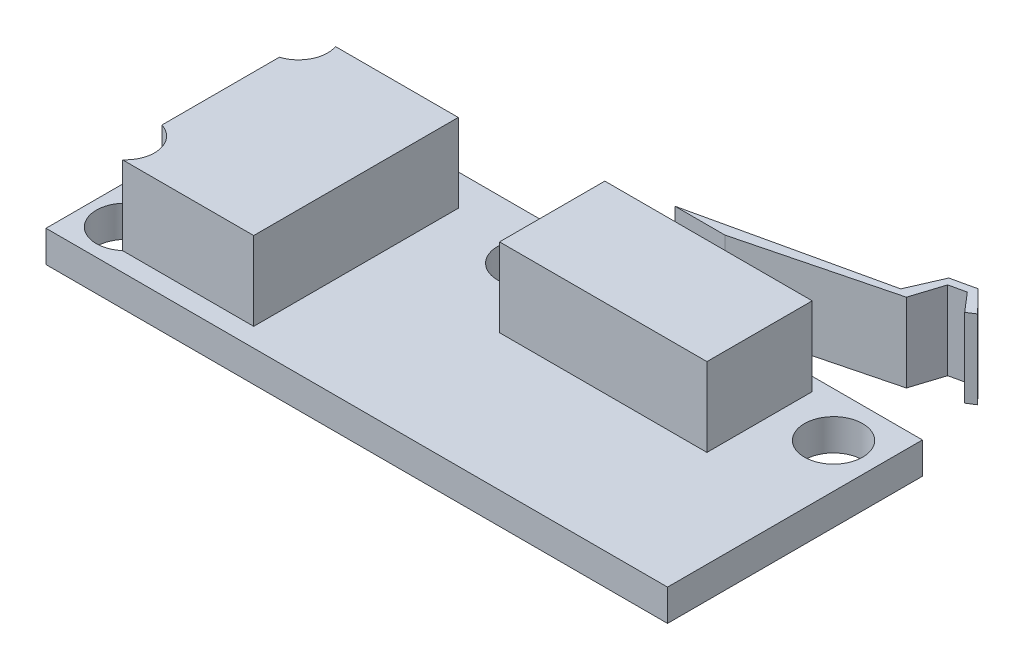
ISO-10303-21;
HEADER;
FILE_DESCRIPTION(('STEP AP214'),'2;1');
FILE_NAME('part.step','',(''),(''),'','','');
FILE_SCHEMA(('AUTOMOTIVE_DESIGN { 1 0 10303 214 1 1 1 1 }'));
ENDSEC;
DATA;
#1=APPLICATION_CONTEXT('core data for automotive mechanical design processes');
#2=APPLICATION_PROTOCOL_DEFINITION('international standard','automotive_design',2000,#1);
#3=PRODUCT_CONTEXT('',#1,'mechanical');
#4=PRODUCT('Part','Part','',(#3));
#5=PRODUCT_RELATED_PRODUCT_CATEGORY('part','',(#4));
#6=PRODUCT_DEFINITION_FORMATION('','',#4);
#7=PRODUCT_DEFINITION_CONTEXT('part definition',#1,'design');
#8=PRODUCT_DEFINITION('design','',#6,#7);
#9=PRODUCT_DEFINITION_SHAPE('','',#8);
#10=(LENGTH_UNIT() NAMED_UNIT(*) SI_UNIT(.MILLI.,.METRE.));
#11=(NAMED_UNIT(*) PLANE_ANGLE_UNIT() SI_UNIT($,.RADIAN.));
#12=(NAMED_UNIT(*) SI_UNIT($,.STERADIAN.) SOLID_ANGLE_UNIT());
#13=UNCERTAINTY_MEASURE_WITH_UNIT(LENGTH_MEASURE(1.E-05),#10,'distance_accuracy_value','');
#14=(GEOMETRIC_REPRESENTATION_CONTEXT(3) GLOBAL_UNCERTAINTY_ASSIGNED_CONTEXT((#13)) GLOBAL_UNIT_ASSIGNED_CONTEXT((#10,
#11,#12)) REPRESENTATION_CONTEXT('',''));
#15=CARTESIAN_POINT('',(0.,0.,0.));
#16=DIRECTION('',(0.,0.,1.));
#17=DIRECTION('',(1.,0.,0.));
#18=AXIS2_PLACEMENT_3D('',#15,#16,#17);
#19=CARTESIAN_POINT('',(-2.23414961367482,7.,-8.74511556332331));
#20=DIRECTION('',(0.247524089134422,0.,0.96888173958341));
#21=DIRECTION('',(0.96888173958341,0.,-0.247524089134422));
#22=AXIS2_PLACEMENT_3D('',#19,#20,#21);
#23=PLANE('',#22);
#24=DIRECTION('',(-0.96888173958341,0.,0.247524089134422));
#25=VECTOR('',#24,1.);
#26=CARTESIAN_POINT('',(-2.23414961367482,2.,-8.74511556332331));
#27=LINE('',#26,#25);
#28=CARTESIAN_POINT('',(36.1344643050712,2.,-18.5472986612021));
#29=VERTEX_POINT('',#28);
#30=CARTESIAN_POINT('',(26.9464502489837,2.,-16.2));
#31=VERTEX_POINT('',#30);
#32=EDGE_CURVE('E156',#29,#31,#27,.T.);
#33=ORIENTED_EDGE('',*,*,#32,.F.);
#34=DIRECTION('',(0.,-1.,0.));
#35=VECTOR('',#34,1.);
#36=CARTESIAN_POINT('',(36.1344643050712,7.,-18.5472986612021));
#37=LINE('',#36,#35);
#38=CARTESIAN_POINT('',(36.1344643050712,7.,-18.5472986612021));
#39=VERTEX_POINT('',#38);
#40=EDGE_CURVE('E12',#39,#29,#37,.T.);
#41=ORIENTED_EDGE('',*,*,#40,.F.);
#42=DIRECTION('',(-0.96888173958341,0.,0.247524089134422));
#43=VECTOR('',#42,1.);
#44=CARTESIAN_POINT('',(-2.23414961367482,7.,-8.74511556332331));
#45=LINE('',#44,#43);
#46=CARTESIAN_POINT('',(26.9464502489837,7.,-16.2));
#47=VERTEX_POINT('',#46);
#48=EDGE_CURVE('E182',#39,#47,#45,.T.);
#49=ORIENTED_EDGE('',*,*,#48,.T.);
#50=DIRECTION('',(0.,-1.,0.));
#51=VECTOR('',#50,1.);
#52=CARTESIAN_POINT('',(26.9464502489837,7.,-16.2));
#53=LINE('',#52,#51);
#54=EDGE_CURVE('E67',#47,#31,#53,.T.);
#55=ORIENTED_EDGE('',*,*,#54,.T.);
#56=EDGE_LOOP('',(#33,#41,#49,#55));
#57=FACE_BOUND('',#56,.T.);
#58=ADVANCED_FACE('F51',(#57),#23,.T.);
#59=CARTESIAN_POINT('',(27.4688461316818,7.,8.7273257582017));
#60=DIRECTION('',(0.953053626595874,0.,0.302801560155249));
#61=DIRECTION('',(0.302801560155249,0.,-0.953053626595874));
#62=AXIS2_PLACEMENT_3D('',#59,#60,#61);
#63=PLANE('',#62);
#64=DIRECTION('',(-0.302801560155249,0.,0.953053626595874));
#65=VECTOR('',#64,1.);
#66=CARTESIAN_POINT('',(27.4688461316818,2.,8.7273257582017));
#67=LINE('',#66,#65);
#68=CARTESIAN_POINT('',(36.7656875874469,2.,-20.5340441659195));
#69=VERTEX_POINT('',#68);
#70=EDGE_CURVE('E158',#69,#29,#67,.T.);
#71=ORIENTED_EDGE('',*,*,#70,.F.);
#72=DIRECTION('',(0.,-1.,0.));
#73=VECTOR('',#72,1.);
#74=CARTESIAN_POINT('',(36.7656875874469,7.,-20.5340441659195));
#75=LINE('',#74,#73);
#76=CARTESIAN_POINT('',(36.7656875874469,7.,-20.5340441659195));
#77=VERTEX_POINT('',#76);
#78=EDGE_CURVE('E59',#77,#69,#75,.T.);
#79=ORIENTED_EDGE('',*,*,#78,.F.);
#80=DIRECTION('',(-0.302801560155249,0.,0.953053626595874));
#81=VECTOR('',#80,1.);
#82=CARTESIAN_POINT('',(27.4688461316818,7.,8.7273257582017));
#83=LINE('',#82,#81);
#84=EDGE_CURVE('E215',#77,#39,#83,.T.);
#85=ORIENTED_EDGE('',*,*,#84,.T.);
#86=ORIENTED_EDGE('',*,*,#40,.T.);
#87=EDGE_LOOP('',(#71,#79,#85,#86));
#88=FACE_BOUND('',#87,.T.);
#89=ADVANCED_FACE('F203',(#88),#63,.T.);
#90=CARTESIAN_POINT('',(-2.62300731728257,7.,-11.7144016111648));
#91=DIRECTION('',(0.218502495932595,0.,0.975836389601877));
#92=DIRECTION('',(0.975836389601877,0.,-0.218502495932595));
#93=AXIS2_PLACEMENT_3D('',#90,#91,#92);
#94=PLANE('',#93);
#95=DIRECTION('',(-0.975836389601877,0.,0.218502495932595));
#96=VECTOR('',#95,1.);
#97=CARTESIAN_POINT('',(-2.62300731728257,2.,-11.7144016111648));
#98=LINE('',#97,#96);
#99=CARTESIAN_POINT('',(37.789665500582,2.,-20.7633261769041));
#100=VERTEX_POINT('',#99);
#101=EDGE_CURVE('E161',#100,#69,#98,.T.);
#102=ORIENTED_EDGE('',*,*,#101,.F.);
#103=DIRECTION('',(0.,-1.,0.));
#104=VECTOR('',#103,1.);
#105=CARTESIAN_POINT('',(37.789665500582,7.,-20.7633261769041));
#106=LINE('',#105,#104);
#107=CARTESIAN_POINT('',(37.789665500582,7.,-20.7633261769041));
#108=VERTEX_POINT('',#107);
#109=EDGE_CURVE('E192',#108,#100,#106,.T.);
#110=ORIENTED_EDGE('',*,*,#109,.F.);
#111=DIRECTION('',(-0.975836389601877,0.,0.218502495932595));
#112=VECTOR('',#111,1.);
#113=CARTESIAN_POINT('',(-2.62300731728257,7.,-11.7144016111648));
#114=LINE('',#113,#112);
#115=EDGE_CURVE('E199',#108,#77,#114,.T.);
#116=ORIENTED_EDGE('',*,*,#115,.T.);
#117=ORIENTED_EDGE('',*,*,#78,.T.);
#118=EDGE_LOOP('',(#102,#110,#116,#117));
#119=FACE_BOUND('',#118,.T.);
#120=ADVANCED_FACE('F197',(#119),#94,.T.);
#121=CARTESIAN_POINT('',(32.0045274435752,7.,-27.4968475219448));
#122=DIRECTION('',(-0.758501989584475,0.,0.651670723445816));
#123=DIRECTION('',(0.651670723445816,0.,0.758501989584475));
#124=AXIS2_PLACEMENT_3D('',#121,#122,#123);
#125=PLANE('',#124);
#126=DIRECTION('',(-0.651670723445816,0.,-0.758501989584475));
#127=VECTOR('',#126,1.);
#128=CARTESIAN_POINT('',(32.0045274435752,2.,-27.4968475219448));
#129=LINE('',#128,#127);
#130=CARTESIAN_POINT('',(38.8176849587806,2.,-19.5667789386729));
#131=VERTEX_POINT('',#130);
#132=EDGE_CURVE('E164',#131,#100,#129,.T.);
#133=ORIENTED_EDGE('',*,*,#132,.F.);
#134=DIRECTION('',(0.,-1.,0.));
#135=VECTOR('',#134,1.);
#136=CARTESIAN_POINT('',(38.8176849587806,7.,-19.5667789386729));
#137=LINE('',#136,#135);
#138=CARTESIAN_POINT('',(38.8176849587806,7.,-19.5667789386729));
#139=VERTEX_POINT('',#138);
#140=EDGE_CURVE('E190',#139,#131,#137,.T.);
#141=ORIENTED_EDGE('',*,*,#140,.F.);
#142=DIRECTION('',(-0.651670723445816,0.,-0.758501989584475));
#143=VECTOR('',#142,1.);
#144=CARTESIAN_POINT('',(32.0045274435752,7.,-27.4968475219448));
#145=LINE('',#144,#143);
#146=EDGE_CURVE('E212',#139,#108,#145,.T.);
#147=ORIENTED_EDGE('',*,*,#146,.T.);
#148=ORIENTED_EDGE('',*,*,#109,.T.);
#149=EDGE_LOOP('',(#133,#141,#147,#148));
#150=FACE_BOUND('',#149,.T.);
#151=ADVANCED_FACE('F209',(#150),#125,.T.);
#152=CARTESIAN_POINT('',(2.26813661782428,7.,3.58126834393304));
#153=DIRECTION('',(0.535052081184349,0.,0.844819075554226));
#154=DIRECTION('',(0.844819075554226,0.,-0.535052081184349));
#155=AXIS2_PLACEMENT_3D('',#152,#153,#154);
#156=PLANE('',#155);
#157=DIRECTION('',(-0.844819075554226,0.,0.535052081184349));
#158=VECTOR('',#157,1.);
#159=CARTESIAN_POINT('',(2.26813661782428,2.,3.58126834393304));
#160=LINE('',#159,#158);
#161=CARTESIAN_POINT('',(39.3232682988783,2.,-19.8869817207348));
#162=VERTEX_POINT('',#161);
#163=EDGE_CURVE('E167',#162,#131,#160,.T.);
#164=ORIENTED_EDGE('',*,*,#163,.F.);
#165=DIRECTION('',(0.,-1.,0.));
#166=VECTOR('',#165,1.);
#167=CARTESIAN_POINT('',(39.3232682988783,7.,-19.8869817207348));
#168=LINE('',#167,#166);
#169=CARTESIAN_POINT('',(39.3232682988783,7.,-19.8869817207348));
#170=VERTEX_POINT('',#169);
#171=EDGE_CURVE('E188',#170,#162,#168,.T.);
#172=ORIENTED_EDGE('',*,*,#171,.F.);
#173=DIRECTION('',(-0.844819075554226,0.,0.535052081184349));
#174=VECTOR('',#173,1.);
#175=CARTESIAN_POINT('',(2.26813661782428,7.,3.58126834393304));
#176=LINE('',#175,#174);
#177=EDGE_CURVE('E217',#170,#139,#176,.T.);
#178=ORIENTED_EDGE('',*,*,#177,.T.);
#179=ORIENTED_EDGE('',*,*,#140,.T.);
#180=EDGE_LOOP('',(#164,#172,#178,#179));
#181=FACE_BOUND('',#180,.T.);
#182=ADVANCED_FACE('F250',(#181),#156,.T.);
#183=CARTESIAN_POINT('',(29.8979276890093,7.,-29.4542869099486));
#184=DIRECTION('',(0.712372301225332,0.,-0.701801755802111));
#185=DIRECTION('',(-0.701801755802111,0.,-0.712372301225332));
#186=AXIS2_PLACEMENT_3D('',#183,#184,#185);
#187=PLANE('',#186);
#188=DIRECTION('',(0.701801755802111,0.,0.712372301225332));
#189=VECTOR('',#188,1.);
#190=CARTESIAN_POINT('',(29.8979276890093,2.,-29.4542869099486));
#191=LINE('',#190,#189);
#192=CARTESIAN_POINT('',(37.9424682733537,2.,-21.2885793707587));
#193=VERTEX_POINT('',#192);
#194=EDGE_CURVE('E170',#193,#162,#191,.T.);
#195=ORIENTED_EDGE('',*,*,#194,.F.);
#196=DIRECTION('',(0.,-1.,0.));
#197=VECTOR('',#196,1.);
#198=CARTESIAN_POINT('',(37.9424682733537,7.,-21.2885793707587));
#199=LINE('',#198,#197);
#200=CARTESIAN_POINT('',(37.9424682733537,7.,-21.2885793707587));
#201=VERTEX_POINT('',#200);
#202=EDGE_CURVE('E186',#201,#193,#199,.T.);
#203=ORIENTED_EDGE('',*,*,#202,.F.);
#204=DIRECTION('',(0.701801755802111,0.,0.712372301225332));
#205=VECTOR('',#204,1.);
#206=CARTESIAN_POINT('',(29.8979276890093,7.,-29.4542869099486));
#207=LINE('',#206,#205);
#208=EDGE_CURVE('E223',#201,#170,#207,.T.);
#209=ORIENTED_EDGE('',*,*,#208,.T.);
#210=ORIENTED_EDGE('',*,*,#171,.T.);
#211=EDGE_LOOP('',(#195,#203,#209,#210));
#212=FACE_BOUND('',#211,.T.);
#213=ADVANCED_FACE('F253',(#212),#187,.T.);
#214=CARTESIAN_POINT('',(-2.72770789965545,7.,-12.1819964450632));
#215=DIRECTION('',(-0.218502495932594,0.,-0.975836389601877));
#216=DIRECTION('',(-0.975836389601877,0.,0.218502495932594));
#217=AXIS2_PLACEMENT_3D('',#214,#215,#216);
#218=PLANE('',#217);
#219=DIRECTION('',(0.975836389601877,0.,-0.218502495932594));
#220=VECTOR('',#219,1.);
#221=CARTESIAN_POINT('',(-2.72770789965545,2.,-12.1819964450632));
#222=LINE('',#221,#220);
#223=CARTESIAN_POINT('',(36.4245904823182,2.,-20.9487067349399));
#224=VERTEX_POINT('',#223);
#225=EDGE_CURVE('E173',#224,#193,#222,.T.);
#226=ORIENTED_EDGE('',*,*,#225,.F.);
#227=DIRECTION('',(0.,-1.,0.));
#228=VECTOR('',#227,1.);
#229=CARTESIAN_POINT('',(36.4245904823182,7.,-20.9487067349399));
#230=LINE('',#229,#228);
#231=CARTESIAN_POINT('',(36.4245904823182,7.,-20.9487067349399));
#232=VERTEX_POINT('',#231);
#233=EDGE_CURVE('E138',#232,#224,#230,.T.);
#234=ORIENTED_EDGE('',*,*,#233,.F.);
#235=DIRECTION('',(0.975836389601877,0.,-0.218502495932594));
#236=VECTOR('',#235,1.);
#237=CARTESIAN_POINT('',(-2.72770789965545,7.,-12.1819964450632));
#238=LINE('',#237,#236);
#239=EDGE_CURVE('E148',#232,#201,#238,.T.);
#240=ORIENTED_EDGE('',*,*,#239,.T.);
#241=ORIENTED_EDGE('',*,*,#202,.T.);
#242=EDGE_LOOP('',(#226,#234,#240,#241));
#243=FACE_BOUND('',#242,.T.);
#244=ADVANCED_FACE('F227',(#243),#218,.T.);
#245=CARTESIAN_POINT('',(22.9142511414293,7.,10.0022524823698));
#246=DIRECTION('',(-0.91649089352104,0.,-0.400055548759177));
#247=DIRECTION('',(-0.400055548759177,0.,0.91649089352104));
#248=AXIS2_PLACEMENT_3D('',#245,#246,#247);
#249=PLANE('',#248);
#250=DIRECTION('',(0.400055548759177,0.,-0.91649089352104));
#251=VECTOR('',#250,1.);
#252=CARTESIAN_POINT('',(22.9142511414293,2.,10.0022524823698));
#253=LINE('',#252,#251);
#254=CARTESIAN_POINT('',(35.4976876921392,2.,-18.8252567065296));
#255=VERTEX_POINT('',#254);
#256=EDGE_CURVE('E134',#255,#224,#253,.T.);
#257=ORIENTED_EDGE('',*,*,#256,.F.);
#258=DIRECTION('',(0.,-1.,0.));
#259=VECTOR('',#258,1.);
#260=CARTESIAN_POINT('',(35.4976876921392,7.,-18.8252567065296));
#261=LINE('',#260,#259);
#262=CARTESIAN_POINT('',(35.4976876921392,7.,-18.8252567065296));
#263=VERTEX_POINT('',#262);
#264=EDGE_CURVE('E129',#263,#255,#261,.T.);
#265=ORIENTED_EDGE('',*,*,#264,.F.);
#266=DIRECTION('',(0.400055548759177,0.,-0.91649089352104));
#267=VECTOR('',#266,1.);
#268=CARTESIAN_POINT('',(22.9142511414293,7.,10.0022524823698));
#269=LINE('',#268,#267);
#270=EDGE_CURVE('E132',#263,#232,#269,.T.);
#271=ORIENTED_EDGE('',*,*,#270,.T.);
#272=ORIENTED_EDGE('',*,*,#233,.T.);
#273=EDGE_LOOP('',(#257,#265,#271,#272));
#274=FACE_BOUND('',#273,.T.);
#275=ADVANCED_FACE('F131',(#274),#249,.T.);
#276=CARTESIAN_POINT('',(-2.31919361515271,7.,-10.3575637181577));
#277=DIRECTION('',(-0.218502495932595,0.,-0.975836389601877));
#278=DIRECTION('',(-0.975836389601877,0.,0.218502495932595));
#279=AXIS2_PLACEMENT_3D('',#276,#277,#278);
#280=PLANE('',#279);
#281=DIRECTION('',(0.975836389601877,0.,-0.218502495932595));
#282=VECTOR('',#281,1.);
#283=CARTESIAN_POINT('',(-2.31919361515271,2.,-10.3575637181577));
#284=LINE('',#283,#282);
#285=CARTESIAN_POINT('',(23.7732402649195,2.,-16.2));
#286=VERTEX_POINT('',#285);
#287=EDGE_CURVE('E177',#286,#255,#284,.T.);
#288=ORIENTED_EDGE('',*,*,#287,.F.);
#289=DIRECTION('',(0.,-1.,0.));
#290=VECTOR('',#289,1.);
#291=CARTESIAN_POINT('',(23.7732402649195,7.,-16.2));
#292=LINE('',#291,#290);
#293=CARTESIAN_POINT('',(23.7732402649195,7.,-16.2));
#294=VERTEX_POINT('',#293);
#295=EDGE_CURVE('E98',#294,#286,#292,.T.);
#296=ORIENTED_EDGE('',*,*,#295,.F.);
#297=DIRECTION('',(0.975836389601877,0.,-0.218502495932595));
#298=VECTOR('',#297,1.);
#299=CARTESIAN_POINT('',(-2.31919361515271,7.,-10.3575637181577));
#300=LINE('',#299,#298);
#301=EDGE_CURVE('E145',#294,#263,#300,.T.);
#302=ORIENTED_EDGE('',*,*,#301,.T.);
#303=ORIENTED_EDGE('',*,*,#264,.T.);
#304=EDGE_LOOP('',(#288,#296,#302,#303));
#305=FACE_BOUND('',#304,.T.);
#306=ADVANCED_FACE('F150',(#305),#280,.T.);
#307=CARTESIAN_POINT('',(0.,7.,-16.2));
#308=DIRECTION('',(0.,0.,1.));
#309=DIRECTION('',(1.,0.,0.));
#310=AXIS2_PLACEMENT_3D('',#307,#308,#309);
#311=PLANE('',#310);
#312=DIRECTION('',(-1.,0.,0.));
#313=VECTOR('',#312,1.);
#314=CARTESIAN_POINT('',(0.,2.,-16.2));
#315=LINE('',#314,#313);
#316=EDGE_CURVE('E179',#31,#286,#315,.T.);
#317=ORIENTED_EDGE('',*,*,#316,.F.);
#318=ORIENTED_EDGE('',*,*,#54,.F.);
#319=DIRECTION('',(-1.,0.,0.));
#320=VECTOR('',#319,1.);
#321=CARTESIAN_POINT('',(0.,7.,-16.2));
#322=LINE('',#321,#320);
#323=EDGE_CURVE('E151',#47,#294,#322,.T.);
#324=ORIENTED_EDGE('',*,*,#323,.T.);
#325=ORIENTED_EDGE('',*,*,#295,.T.);
#326=EDGE_LOOP('',(#317,#318,#324,#325));
#327=FACE_BOUND('',#326,.T.);
#328=ADVANCED_FACE('F229',(#327),#311,.T.);
#329=CARTESIAN_POINT('',(0.,7.,0.));
#330=DIRECTION('',(0.,1.,0.));
#331=DIRECTION('',(0.,0.,1.));
#332=AXIS2_PLACEMENT_3D('',#329,#330,#331);
#333=PLANE('',#332);
#334=ORIENTED_EDGE('',*,*,#48,.F.);
#335=ORIENTED_EDGE('',*,*,#84,.F.);
#336=ORIENTED_EDGE('',*,*,#115,.F.);
#337=ORIENTED_EDGE('',*,*,#146,.F.);
#338=ORIENTED_EDGE('',*,*,#177,.F.);
#339=ORIENTED_EDGE('',*,*,#208,.F.);
#340=ORIENTED_EDGE('',*,*,#239,.F.);
#341=ORIENTED_EDGE('',*,*,#270,.F.);
#342=ORIENTED_EDGE('',*,*,#301,.F.);
#343=ORIENTED_EDGE('',*,*,#323,.F.);
#344=EDGE_LOOP('',(#334,#335,#336,#337,#338,#339,#340,#341,#342,#343));
#345=FACE_BOUND('',#344,.T.);
#346=ADVANCED_FACE('F143',(#345),#333,.T.);
#347=CARTESIAN_POINT('',(0.,2.,0.));
#348=DIRECTION('',(0.,1.,0.));
#349=DIRECTION('',(0.,0.,1.));
#350=AXIS2_PLACEMENT_3D('',#347,#348,#349);
#351=PLANE('',#350);
#352=ORIENTED_EDGE('',*,*,#32,.T.);
#353=ORIENTED_EDGE('',*,*,#316,.T.);
#354=ORIENTED_EDGE('',*,*,#287,.T.);
#355=ORIENTED_EDGE('',*,*,#256,.T.);
#356=ORIENTED_EDGE('',*,*,#225,.T.);
#357=ORIENTED_EDGE('',*,*,#194,.T.);
#358=ORIENTED_EDGE('',*,*,#163,.T.);
#359=ORIENTED_EDGE('',*,*,#132,.T.);
#360=ORIENTED_EDGE('',*,*,#101,.T.);
#361=ORIENTED_EDGE('',*,*,#70,.T.);
#362=EDGE_LOOP('',(#352,#353,#354,#355,#356,#357,#358,#359,#360,#361));
#363=FACE_BOUND('',#362,.T.);
#364=ADVANCED_FACE('F205',(#363),#351,.F.);
#365=CLOSED_SHELL('',(#58,#89,#120,#151,#182,#213,#244,#275,#306,#328,#346,#364));
#366=MANIFOLD_SOLID_BREP('B2',#365);
#367=CARTESIAN_POINT('',(0.,2.,0.));
#368=DIRECTION('',(0.,-1.,0.));
#369=DIRECTION('',(0.,0.,-1.));
#370=AXIS2_PLACEMENT_3D('',#367,#368,#369);
#371=PLANE('',#370);
#372=DIRECTION('',(1.,0.,0.));
#373=VECTOR('',#372,1.);
#374=CARTESIAN_POINT('',(0.,2.,-15.3535844378589));
#375=LINE('',#374,#373);
#376=CARTESIAN_POINT('',(20.1616597091761,2.,-15.3535844378589));
#377=VERTEX_POINT('',#376);
#378=CARTESIAN_POINT('',(33.3405321077224,2.,-15.3535844378589));
#379=VERTEX_POINT('',#378);
#380=EDGE_CURVE('E346',#377,#379,#375,.T.);
#381=ORIENTED_EDGE('',*,*,#380,.T.);
#382=DIRECTION('',(0.,0.,1.));
#383=VECTOR('',#382,1.);
#384=CARTESIAN_POINT('',(33.3405321077224,2.,0.));
#385=LINE('',#384,#383);
#386=CARTESIAN_POINT('',(33.3405321077224,2.,-8.66303157056619));
#387=VERTEX_POINT('',#386);
#388=EDGE_CURVE('E436',#379,#387,#385,.T.);
#389=ORIENTED_EDGE('',*,*,#388,.T.);
#390=DIRECTION('',(1.,0.,0.));
#391=VECTOR('',#390,1.);
#392=CARTESIAN_POINT('',(0.,2.,-8.66303157056619));
#393=LINE('',#392,#391);
#394=CARTESIAN_POINT('',(20.1616597091761,2.,-8.66303157056619));
#395=VERTEX_POINT('',#394);
#396=EDGE_CURVE('E449',#395,#387,#393,.T.);
#397=ORIENTED_EDGE('',*,*,#396,.F.);
#398=DIRECTION('',(0.,0.,1.));
#399=VECTOR('',#398,1.);
#400=CARTESIAN_POINT('',(20.1616597091761,2.,0.));
#401=LINE('',#400,#399);
#402=EDGE_CURVE('E351',#377,#395,#401,.T.);
#403=ORIENTED_EDGE('',*,*,#402,.F.);
#404=EDGE_LOOP('',(#381,#389,#397,#403));
#405=FACE_BOUND('',#404,.T.);
#406=CARTESIAN_POINT('',(36.7,2.,-13.35));
#407=DIRECTION('',(0.,1.,0.));
#408=DIRECTION('',(0.,0.,1.));
#409=AXIS2_PLACEMENT_3D('',#406,#407,#408);
#410=CIRCLE('',#409,1.85);
#411=CARTESIAN_POINT('',(36.7,2.,-11.5));
#412=VERTEX_POINT('',#411);
#413=EDGE_CURVE('E508',#412,#412,#410,.T.);
#414=ORIENTED_EDGE('',*,*,#413,.F.);
#415=EDGE_LOOP('',(#414));
#416=FACE_BOUND('',#415,.T.);
#417=CARTESIAN_POINT('',(17.2,2.,-13.35));
#418=DIRECTION('',(0.,1.,0.));
#419=DIRECTION('',(0.,0.,1.));
#420=AXIS2_PLACEMENT_3D('',#417,#418,#419);
#421=CIRCLE('',#420,1.85);
#422=CARTESIAN_POINT('',(17.2,2.,-11.5));
#423=VERTEX_POINT('',#422);
#424=EDGE_CURVE('E514',#423,#423,#421,.T.);
#425=ORIENTED_EDGE('',*,*,#424,.F.);
#426=EDGE_LOOP('',(#425));
#427=FACE_BOUND('',#426,.T.);
#428=DIRECTION('',(0.,0.,1.));
#429=VECTOR('',#428,1.);
#430=CARTESIAN_POINT('',(0.,2.,0.));
#431=LINE('',#430,#429);
#432=CARTESIAN_POINT('',(0.,2.,-16.2));
#433=VERTEX_POINT('',#432);
#434=CARTESIAN_POINT('',(0.,2.,0.));
#435=VERTEX_POINT('',#434);
#436=EDGE_CURVE('E532',#433,#435,#431,.T.);
#437=ORIENTED_EDGE('',*,*,#436,.T.);
#438=DIRECTION('',(1.,0.,0.));
#439=VECTOR('',#438,1.);
#440=CARTESIAN_POINT('',(0.,2.,0.));
#441=LINE('',#440,#439);
#442=CARTESIAN_POINT('',(39.5,2.,0.));
#443=VERTEX_POINT('',#442);
#444=EDGE_CURVE('E535',#435,#443,#441,.T.);
#445=ORIENTED_EDGE('',*,*,#444,.T.);
#446=DIRECTION('',(0.,0.,-1.));
#447=VECTOR('',#446,1.);
#448=CARTESIAN_POINT('',(39.5,2.,0.));
#449=LINE('',#448,#447);
#450=CARTESIAN_POINT('',(39.5,2.,-16.2));
#451=VERTEX_POINT('',#450);
#452=EDGE_CURVE('E538',#443,#451,#449,.T.);
#453=ORIENTED_EDGE('',*,*,#452,.T.);
#454=DIRECTION('',(-1.,0.,0.));
#455=VECTOR('',#454,1.);
#456=CARTESIAN_POINT('',(0.,2.,-16.2));
#457=LINE('',#456,#455);
#458=EDGE_CURVE('E540',#451,#433,#457,.T.);
#459=ORIENTED_EDGE('',*,*,#458,.T.);
#460=EDGE_LOOP('',(#437,#445,#453,#459));
#461=FACE_BOUND('',#460,.T.);
#462=DIRECTION('',(0.,0.,1.));
#463=VECTOR('',#462,1.);
#464=CARTESIAN_POINT('',(3.,2.,0.));
#465=LINE('',#464,#463);
#466=CARTESIAN_POINT('',(3.,2.,-11.8336478267344));
#467=VERTEX_POINT('',#466);
#468=CARTESIAN_POINT('',(3.,2.,-4.36635217326557));
#469=VERTEX_POINT('',#468);
#470=EDGE_CURVE('E490',#467,#469,#465,.T.);
#471=ORIENTED_EDGE('',*,*,#470,.F.);
#472=CARTESIAN_POINT('',(2.45,2.,-13.6));
#473=DIRECTION('',(0.,1.,0.));
#474=DIRECTION('',(0.,0.,1.));
#475=AXIS2_PLACEMENT_3D('',#472,#473,#474);
#476=CIRCLE('',#475,1.85);
#477=CARTESIAN_POINT('',(4.2,2.,-14.2));
#478=VERTEX_POINT('',#477);
#479=EDGE_CURVE('E520',#478,#467,#476,.T.);
#480=ORIENTED_EDGE('',*,*,#479,.F.);
#481=DIRECTION('',(1.,0.,0.));
#482=VECTOR('',#481,1.);
#483=CARTESIAN_POINT('',(0.,2.,-14.2));
#484=LINE('',#483,#482);
#485=CARTESIAN_POINT('',(12.,2.,-14.2));
#486=VERTEX_POINT('',#485);
#487=EDGE_CURVE('E487',#478,#486,#484,.T.);
#488=ORIENTED_EDGE('',*,*,#487,.T.);
#489=DIRECTION('',(0.,0.,1.));
#490=VECTOR('',#489,1.);
#491=CARTESIAN_POINT('',(12.,2.,0.));
#492=LINE('',#491,#490);
#493=CARTESIAN_POINT('',(12.,2.,-1.2));
#494=VERTEX_POINT('',#493);
#495=EDGE_CURVE('E439',#486,#494,#492,.T.);
#496=ORIENTED_EDGE('',*,*,#495,.T.);
#497=DIRECTION('',(1.,0.,0.));
#498=VECTOR('',#497,1.);
#499=CARTESIAN_POINT('',(0.,2.,-1.2));
#500=LINE('',#499,#498);
#501=CARTESIAN_POINT('',(3.65933866224478,2.,-1.2));
#502=VERTEX_POINT('',#501);
#503=EDGE_CURVE('E473',#502,#494,#500,.T.);
#504=ORIENTED_EDGE('',*,*,#503,.F.);
#505=CARTESIAN_POINT('',(2.45,2.,-2.6));
#506=DIRECTION('',(0.,1.,0.));
#507=DIRECTION('',(0.,0.,1.));
#508=AXIS2_PLACEMENT_3D('',#505,#506,#507);
#509=CIRCLE('',#508,1.85);
#510=EDGE_CURVE('E526',#469,#502,#509,.T.);
#511=ORIENTED_EDGE('',*,*,#510,.F.);
#512=EDGE_LOOP('',(#471,#480,#488,#496,#504,#511));
#513=FACE_BOUND('',#512,.T.);
#514=ADVANCED_FACE('F331',(#405,#416,#427,#461,#513),#371,.F.);
#515=CARTESIAN_POINT('',(0.,0.,0.));
#516=DIRECTION('',(0.,-1.,0.));
#517=DIRECTION('',(0.,0.,-1.));
#518=AXIS2_PLACEMENT_3D('',#515,#516,#517);
#519=PLANE('',#518);
#520=CARTESIAN_POINT('',(17.2,0.,-13.35));
#521=DIRECTION('',(0.,1.,0.));
#522=DIRECTION('',(0.,0.,1.));
#523=AXIS2_PLACEMENT_3D('',#520,#521,#522);
#524=CIRCLE('',#523,1.85);
#525=CARTESIAN_POINT('',(17.2,0.,-11.5));
#526=VERTEX_POINT('',#525);
#527=EDGE_CURVE('E511',#526,#526,#524,.T.);
#528=ORIENTED_EDGE('',*,*,#527,.T.);
#529=EDGE_LOOP('',(#528));
#530=FACE_BOUND('',#529,.T.);
#531=CARTESIAN_POINT('',(2.45,0.,-2.6));
#532=DIRECTION('',(0.,1.,0.));
#533=DIRECTION('',(0.,0.,1.));
#534=AXIS2_PLACEMENT_3D('',#531,#532,#533);
#535=CIRCLE('',#534,1.85);
#536=CARTESIAN_POINT('',(2.45,0.,-0.75));
#537=VERTEX_POINT('',#536);
#538=EDGE_CURVE('E523',#537,#537,#535,.T.);
#539=ORIENTED_EDGE('',*,*,#538,.T.);
#540=EDGE_LOOP('',(#539));
#541=FACE_BOUND('',#540,.T.);
#542=DIRECTION('',(0.,0.,1.));
#543=VECTOR('',#542,1.);
#544=CARTESIAN_POINT('',(0.,0.,0.));
#545=LINE('',#544,#543);
#546=CARTESIAN_POINT('',(0.,0.,-16.2));
#547=VERTEX_POINT('',#546);
#548=CARTESIAN_POINT('',(0.,0.,0.));
#549=VERTEX_POINT('',#548);
#550=EDGE_CURVE('E529',#547,#549,#545,.T.);
#551=ORIENTED_EDGE('',*,*,#550,.F.);
#552=DIRECTION('',(-1.,0.,0.));
#553=VECTOR('',#552,1.);
#554=CARTESIAN_POINT('',(0.,0.,-16.2));
#555=LINE('',#554,#553);
#556=CARTESIAN_POINT('',(39.5,0.,-16.2));
#557=VERTEX_POINT('',#556);
#558=EDGE_CURVE('E536',#557,#547,#555,.T.);
#559=ORIENTED_EDGE('',*,*,#558,.F.);
#560=DIRECTION('',(0.,0.,-1.));
#561=VECTOR('',#560,1.);
#562=CARTESIAN_POINT('',(39.5,0.,0.));
#563=LINE('',#562,#561);
#564=CARTESIAN_POINT('',(39.5,0.,0.));
#565=VERTEX_POINT('',#564);
#566=EDGE_CURVE('E547',#565,#557,#563,.T.);
#567=ORIENTED_EDGE('',*,*,#566,.F.);
#568=DIRECTION('',(1.,0.,0.));
#569=VECTOR('',#568,1.);
#570=CARTESIAN_POINT('',(0.,0.,0.));
#571=LINE('',#570,#569);
#572=EDGE_CURVE('E545',#549,#565,#571,.T.);
#573=ORIENTED_EDGE('',*,*,#572,.F.);
#574=EDGE_LOOP('',(#551,#559,#567,#573));
#575=FACE_BOUND('',#574,.T.);
#576=CARTESIAN_POINT('',(2.45,0.,-13.6));
#577=DIRECTION('',(0.,1.,0.));
#578=DIRECTION('',(0.,0.,1.));
#579=AXIS2_PLACEMENT_3D('',#576,#577,#578);
#580=CIRCLE('',#579,1.85);
#581=CARTESIAN_POINT('',(2.45,0.,-11.75));
#582=VERTEX_POINT('',#581);
#583=EDGE_CURVE('E517',#582,#582,#580,.T.);
#584=ORIENTED_EDGE('',*,*,#583,.T.);
#585=EDGE_LOOP('',(#584));
#586=FACE_BOUND('',#585,.T.);
#587=CARTESIAN_POINT('',(36.7,0.,-13.35));
#588=DIRECTION('',(0.,1.,0.));
#589=DIRECTION('',(0.,0.,1.));
#590=AXIS2_PLACEMENT_3D('',#587,#588,#589);
#591=CIRCLE('',#590,1.85);
#592=CARTESIAN_POINT('',(36.7,0.,-11.5));
#593=VERTEX_POINT('',#592);
#594=EDGE_CURVE('E507',#593,#593,#591,.T.);
#595=ORIENTED_EDGE('',*,*,#594,.T.);
#596=EDGE_LOOP('',(#595));
#597=FACE_BOUND('',#596,.T.);
#598=ADVANCED_FACE('F565',(#530,#541,#575,#586,#597),#519,.T.);
#599=CARTESIAN_POINT('',(0.,2.,0.));
#600=DIRECTION('',(1.,0.,0.));
#601=DIRECTION('',(0.,0.,-1.));
#602=AXIS2_PLACEMENT_3D('',#599,#600,#601);
#603=PLANE('',#602);
#604=ORIENTED_EDGE('',*,*,#550,.T.);
#605=DIRECTION('',(0.,-1.,0.));
#606=VECTOR('',#605,1.);
#607=CARTESIAN_POINT('',(0.,2.,0.));
#608=LINE('',#607,#606);
#609=EDGE_CURVE('E49',#435,#549,#608,.T.);
#610=ORIENTED_EDGE('',*,*,#609,.F.);
#611=ORIENTED_EDGE('',*,*,#436,.F.);
#612=DIRECTION('',(0.,-1.,0.));
#613=VECTOR('',#612,1.);
#614=CARTESIAN_POINT('',(0.,2.,-16.2));
#615=LINE('',#614,#613);
#616=EDGE_CURVE('E542',#433,#547,#615,.T.);
#617=ORIENTED_EDGE('',*,*,#616,.T.);
#618=EDGE_LOOP('',(#604,#610,#611,#617));
#619=FACE_BOUND('',#618,.T.);
#620=ADVANCED_FACE('F333',(#619),#603,.F.);
#621=CARTESIAN_POINT('',(0.,2.,0.));
#622=DIRECTION('',(0.,0.,-1.));
#623=DIRECTION('',(-1.,0.,0.));
#624=AXIS2_PLACEMENT_3D('',#621,#622,#623);
#625=PLANE('',#624);
#626=ORIENTED_EDGE('',*,*,#572,.T.);
#627=DIRECTION('',(0.,-1.,0.));
#628=VECTOR('',#627,1.);
#629=CARTESIAN_POINT('',(39.5,2.,0.));
#630=LINE('',#629,#628);
#631=EDGE_CURVE('E339',#443,#565,#630,.T.);
#632=ORIENTED_EDGE('',*,*,#631,.F.);
#633=ORIENTED_EDGE('',*,*,#444,.F.);
#634=ORIENTED_EDGE('',*,*,#609,.T.);
#635=EDGE_LOOP('',(#626,#632,#633,#634));
#636=FACE_BOUND('',#635,.T.);
#637=ADVANCED_FACE('F576',(#636),#625,.F.);
#638=CARTESIAN_POINT('',(39.5,2.,0.));
#639=DIRECTION('',(-1.,0.,0.));
#640=DIRECTION('',(0.,0.,1.));
#641=AXIS2_PLACEMENT_3D('',#638,#639,#640);
#642=PLANE('',#641);
#643=ORIENTED_EDGE('',*,*,#566,.T.);
#644=DIRECTION('',(0.,-1.,0.));
#645=VECTOR('',#644,1.);
#646=CARTESIAN_POINT('',(39.5,2.,-16.2));
#647=LINE('',#646,#645);
#648=EDGE_CURVE('E552',#451,#557,#647,.T.);
#649=ORIENTED_EDGE('',*,*,#648,.F.);
#650=ORIENTED_EDGE('',*,*,#452,.F.);
#651=ORIENTED_EDGE('',*,*,#631,.T.);
#652=EDGE_LOOP('',(#643,#649,#650,#651));
#653=FACE_BOUND('',#652,.T.);
#654=ADVANCED_FACE('F559',(#653),#642,.F.);
#655=CARTESIAN_POINT('',(0.,2.,-16.2));
#656=DIRECTION('',(0.,0.,1.));
#657=DIRECTION('',(1.,0.,0.));
#658=AXIS2_PLACEMENT_3D('',#655,#656,#657);
#659=PLANE('',#658);
#660=ORIENTED_EDGE('',*,*,#558,.T.);
#661=ORIENTED_EDGE('',*,*,#616,.F.);
#662=ORIENTED_EDGE('',*,*,#458,.F.);
#663=ORIENTED_EDGE('',*,*,#648,.T.);
#664=EDGE_LOOP('',(#660,#661,#662,#663));
#665=FACE_BOUND('',#664,.T.);
#666=ADVANCED_FACE('F569',(#665),#659,.F.);
#667=CARTESIAN_POINT('',(2.45,2.,-2.6));
#668=DIRECTION('',(0.,-1.,0.));
#669=DIRECTION('',(0.,0.,-1.));
#670=AXIS2_PLACEMENT_3D('',#667,#668,#669);
#671=CYLINDRICAL_SURFACE('',#670,1.85);
#672=ORIENTED_EDGE('',*,*,#510,.T.);
#673=DIRECTION('',(0.,-1.,0.));
#674=VECTOR('',#673,1.);
#675=CARTESIAN_POINT('',(3.65933866224478,7.,-1.2));
#676=LINE('',#675,#674);
#677=CARTESIAN_POINT('',(3.65933866224478,7.,-1.2));
#678=VERTEX_POINT('',#677);
#679=EDGE_CURVE('E495',#678,#502,#676,.T.);
#680=ORIENTED_EDGE('',*,*,#679,.F.);
#681=CARTESIAN_POINT('',(2.45,7.,-2.6));
#682=DIRECTION('',(0.,1.,0.));
#683=DIRECTION('',(0.,0.,1.));
#684=AXIS2_PLACEMENT_3D('',#681,#682,#683);
#685=CIRCLE('',#684,1.85);
#686=CARTESIAN_POINT('',(3.,7.,-4.36635217326557));
#687=VERTEX_POINT('',#686);
#688=EDGE_CURVE('E480',#687,#678,#685,.F.);
#689=ORIENTED_EDGE('',*,*,#688,.F.);
#690=DIRECTION('',(0.,-1.,0.));
#691=VECTOR('',#690,1.);
#692=CARTESIAN_POINT('',(3.,7.,-4.36635217326557));
#693=LINE('',#692,#691);
#694=EDGE_CURVE('E497',#687,#469,#693,.T.);
#695=ORIENTED_EDGE('',*,*,#694,.T.);
#696=EDGE_LOOP('',(#672,#680,#689,#695));
#697=FACE_BOUND('',#696,.T.);
#698=ORIENTED_EDGE('',*,*,#538,.F.);
#699=EDGE_LOOP('',(#698));
#700=FACE_BOUND('',#699,.T.);
#701=ADVANCED_FACE('F594',(#697,#700),#671,.F.);
#702=CARTESIAN_POINT('',(2.45,2.,-13.6));
#703=DIRECTION('',(0.,-1.,0.));
#704=DIRECTION('',(0.,0.,-1.));
#705=AXIS2_PLACEMENT_3D('',#702,#703,#704);
#706=CYLINDRICAL_SURFACE('',#705,1.85);
#707=ORIENTED_EDGE('',*,*,#479,.T.);
#708=DIRECTION('',(0.,-1.,0.));
#709=VECTOR('',#708,1.);
#710=CARTESIAN_POINT('',(3.,7.,-11.8336478267344));
#711=LINE('',#710,#709);
#712=CARTESIAN_POINT('',(3.,7.,-11.8336478267344));
#713=VERTEX_POINT('',#712);
#714=EDGE_CURVE('E500',#713,#467,#711,.T.);
#715=ORIENTED_EDGE('',*,*,#714,.F.);
#716=CARTESIAN_POINT('',(2.45,7.,-13.6));
#717=DIRECTION('',(0.,1.,0.));
#718=DIRECTION('',(0.,0.,1.));
#719=AXIS2_PLACEMENT_3D('',#716,#717,#718);
#720=CIRCLE('',#719,1.85);
#721=CARTESIAN_POINT('',(4.2,7.,-14.2));
#722=VERTEX_POINT('',#721);
#723=EDGE_CURVE('E476',#722,#713,#720,.F.);
#724=ORIENTED_EDGE('',*,*,#723,.F.);
#725=DIRECTION('',(0.,-1.,0.));
#726=VECTOR('',#725,1.);
#727=CARTESIAN_POINT('',(4.2,7.,-14.2));
#728=LINE('',#727,#726);
#729=EDGE_CURVE('E502',#722,#478,#728,.T.);
#730=ORIENTED_EDGE('',*,*,#729,.T.);
#731=EDGE_LOOP('',(#707,#715,#724,#730));
#732=FACE_BOUND('',#731,.T.);
#733=ORIENTED_EDGE('',*,*,#583,.F.);
#734=EDGE_LOOP('',(#733));
#735=FACE_BOUND('',#734,.T.);
#736=ADVANCED_FACE('F600',(#732,#735),#706,.F.);
#737=CARTESIAN_POINT('',(17.2,2.,-13.35));
#738=DIRECTION('',(0.,-1.,0.));
#739=DIRECTION('',(0.,0.,-1.));
#740=AXIS2_PLACEMENT_3D('',#737,#738,#739);
#741=CYLINDRICAL_SURFACE('',#740,1.85);
#742=ORIENTED_EDGE('',*,*,#424,.T.);
#743=EDGE_LOOP('',(#742));
#744=FACE_BOUND('',#743,.T.);
#745=ORIENTED_EDGE('',*,*,#527,.F.);
#746=EDGE_LOOP('',(#745));
#747=FACE_BOUND('',#746,.T.);
#748=ADVANCED_FACE('F605',(#744,#747),#741,.F.);
#749=CARTESIAN_POINT('',(36.7,2.,-13.35));
#750=DIRECTION('',(0.,-1.,0.));
#751=DIRECTION('',(0.,0.,-1.));
#752=AXIS2_PLACEMENT_3D('',#749,#750,#751);
#753=CYLINDRICAL_SURFACE('',#752,1.85);
#754=ORIENTED_EDGE('',*,*,#413,.T.);
#755=EDGE_LOOP('',(#754));
#756=FACE_BOUND('',#755,.T.);
#757=ORIENTED_EDGE('',*,*,#594,.F.);
#758=EDGE_LOOP('',(#757));
#759=FACE_BOUND('',#758,.T.);
#760=ADVANCED_FACE('F637',(#756,#759),#753,.F.);
#761=CARTESIAN_POINT('',(12.,7.,0.));
#762=DIRECTION('',(1.,0.,0.));
#763=DIRECTION('',(0.,0.,-1.));
#764=AXIS2_PLACEMENT_3D('',#761,#762,#763);
#765=PLANE('',#764);
#766=ORIENTED_EDGE('',*,*,#495,.F.);
#767=DIRECTION('',(0.,-1.,0.));
#768=VECTOR('',#767,1.);
#769=CARTESIAN_POINT('',(12.,7.,-14.2));
#770=LINE('',#769,#768);
#771=CARTESIAN_POINT('',(12.,7.,-14.2));
#772=VERTEX_POINT('',#771);
#773=EDGE_CURVE('E504',#772,#486,#770,.T.);
#774=ORIENTED_EDGE('',*,*,#773,.F.);
#775=DIRECTION('',(0.,0.,1.));
#776=VECTOR('',#775,1.);
#777=CARTESIAN_POINT('',(12.,7.,0.));
#778=LINE('',#777,#776);
#779=CARTESIAN_POINT('',(12.,7.,-1.2));
#780=VERTEX_POINT('',#779);
#781=EDGE_CURVE('E469',#772,#780,#778,.T.);
#782=ORIENTED_EDGE('',*,*,#781,.T.);
#783=DIRECTION('',(0.,-1.,0.));
#784=VECTOR('',#783,1.);
#785=CARTESIAN_POINT('',(12.,7.,-1.2));
#786=LINE('',#785,#784);
#787=EDGE_CURVE('E484',#780,#494,#786,.T.);
#788=ORIENTED_EDGE('',*,*,#787,.T.);
#789=EDGE_LOOP('',(#766,#774,#782,#788));
#790=FACE_BOUND('',#789,.T.);
#791=ADVANCED_FACE('F635',(#790),#765,.T.);
#792=CARTESIAN_POINT('',(0.,7.,-14.2));
#793=DIRECTION('',(0.,0.,-1.));
#794=DIRECTION('',(-1.,0.,0.));
#795=AXIS2_PLACEMENT_3D('',#792,#793,#794);
#796=PLANE('',#795);
#797=ORIENTED_EDGE('',*,*,#487,.F.);
#798=ORIENTED_EDGE('',*,*,#729,.F.);
#799=DIRECTION('',(1.,0.,0.));
#800=VECTOR('',#799,1.);
#801=CARTESIAN_POINT('',(0.,7.,-14.2));
#802=LINE('',#801,#800);
#803=EDGE_CURVE('E472',#722,#772,#802,.T.);
#804=ORIENTED_EDGE('',*,*,#803,.T.);
#805=ORIENTED_EDGE('',*,*,#773,.T.);
#806=EDGE_LOOP('',(#797,#798,#804,#805));
#807=FACE_BOUND('',#806,.T.);
#808=ADVANCED_FACE('F633',(#807),#796,.T.);
#809=CARTESIAN_POINT('',(3.,7.,0.));
#810=DIRECTION('',(1.,0.,0.));
#811=DIRECTION('',(0.,0.,-1.));
#812=AXIS2_PLACEMENT_3D('',#809,#810,#811);
#813=PLANE('',#812);
#814=ORIENTED_EDGE('',*,*,#470,.T.);
#815=ORIENTED_EDGE('',*,*,#694,.F.);
#816=DIRECTION('',(0.,0.,1.));
#817=VECTOR('',#816,1.);
#818=CARTESIAN_POINT('',(3.,7.,0.));
#819=LINE('',#818,#817);
#820=EDGE_CURVE('E478',#713,#687,#819,.T.);
#821=ORIENTED_EDGE('',*,*,#820,.F.);
#822=ORIENTED_EDGE('',*,*,#714,.T.);
#823=EDGE_LOOP('',(#814,#815,#821,#822));
#824=FACE_BOUND('',#823,.T.);
#825=ADVANCED_FACE('F629',(#824),#813,.F.);
#826=CARTESIAN_POINT('',(0.,7.,-1.2));
#827=DIRECTION('',(0.,0.,-1.));
#828=DIRECTION('',(-1.,0.,0.));
#829=AXIS2_PLACEMENT_3D('',#826,#827,#828);
#830=PLANE('',#829);
#831=ORIENTED_EDGE('',*,*,#503,.T.);
#832=ORIENTED_EDGE('',*,*,#787,.F.);
#833=DIRECTION('',(1.,0.,0.));
#834=VECTOR('',#833,1.);
#835=CARTESIAN_POINT('',(0.,7.,-1.2));
#836=LINE('',#835,#834);
#837=EDGE_CURVE('E482',#678,#780,#836,.T.);
#838=ORIENTED_EDGE('',*,*,#837,.F.);
#839=ORIENTED_EDGE('',*,*,#679,.T.);
#840=EDGE_LOOP('',(#831,#832,#838,#839));
#841=FACE_BOUND('',#840,.T.);
#842=ADVANCED_FACE('F620',(#841),#830,.F.);
#843=CARTESIAN_POINT('',(0.,7.,0.));
#844=DIRECTION('',(0.,1.,0.));
#845=DIRECTION('',(0.,0.,1.));
#846=AXIS2_PLACEMENT_3D('',#843,#844,#845);
#847=PLANE('',#846);
#848=ORIENTED_EDGE('',*,*,#781,.F.);
#849=ORIENTED_EDGE('',*,*,#803,.F.);
#850=ORIENTED_EDGE('',*,*,#723,.T.);
#851=ORIENTED_EDGE('',*,*,#820,.T.);
#852=ORIENTED_EDGE('',*,*,#688,.T.);
#853=ORIENTED_EDGE('',*,*,#837,.T.);
#854=EDGE_LOOP('',(#848,#849,#850,#851,#852,#853));
#855=FACE_BOUND('',#854,.T.);
#856=ADVANCED_FACE('F623',(#855),#847,.T.);
#857=CARTESIAN_POINT('',(33.3405321077224,7.,0.));
#858=DIRECTION('',(1.,0.,0.));
#859=DIRECTION('',(0.,0.,-1.));
#860=AXIS2_PLACEMENT_3D('',#857,#858,#859);
#861=PLANE('',#860);
#862=ORIENTED_EDGE('',*,*,#388,.F.);
#863=DIRECTION('',(0.,-1.,0.));
#864=VECTOR('',#863,1.);
#865=CARTESIAN_POINT('',(33.3405321077224,7.,-15.3535844378589));
#866=LINE('',#865,#864);
#867=CARTESIAN_POINT('',(33.3405321077224,7.,-15.3535844378589));
#868=VERTEX_POINT('',#867);
#869=EDGE_CURVE('E431',#868,#379,#866,.T.);
#870=ORIENTED_EDGE('',*,*,#869,.F.);
#871=DIRECTION('',(0.,0.,1.));
#872=VECTOR('',#871,1.);
#873=CARTESIAN_POINT('',(33.3405321077224,7.,0.));
#874=LINE('',#873,#872);
#875=CARTESIAN_POINT('',(33.3405321077224,7.,-8.66303157056619));
#876=VERTEX_POINT('',#875);
#877=EDGE_CURVE('E435',#868,#876,#874,.T.);
#878=ORIENTED_EDGE('',*,*,#877,.T.);
#879=DIRECTION('',(0.,-1.,0.));
#880=VECTOR('',#879,1.);
#881=CARTESIAN_POINT('',(33.3405321077224,7.,-8.66303157056619));
#882=LINE('',#881,#880);
#883=EDGE_CURVE('E458',#876,#387,#882,.T.);
#884=ORIENTED_EDGE('',*,*,#883,.T.);
#885=EDGE_LOOP('',(#862,#870,#878,#884));
#886=FACE_BOUND('',#885,.T.);
#887=ADVANCED_FACE('F433',(#886),#861,.T.);
#888=CARTESIAN_POINT('',(0.,7.,-15.3535844378589));
#889=DIRECTION('',(0.,0.,-1.));
#890=DIRECTION('',(-1.,0.,0.));
#891=AXIS2_PLACEMENT_3D('',#888,#889,#890);
#892=PLANE('',#891);
#893=ORIENTED_EDGE('',*,*,#380,.F.);
#894=DIRECTION('',(0.,-1.,0.));
#895=VECTOR('',#894,1.);
#896=CARTESIAN_POINT('',(20.1616597091761,7.,-15.3535844378589));
#897=LINE('',#896,#895);
#898=CARTESIAN_POINT('',(20.1616597091761,7.,-15.3535844378589));
#899=VERTEX_POINT('',#898);
#900=EDGE_CURVE('E440',#899,#377,#897,.T.);
#901=ORIENTED_EDGE('',*,*,#900,.F.);
#902=DIRECTION('',(1.,0.,0.));
#903=VECTOR('',#902,1.);
#904=CARTESIAN_POINT('',(0.,7.,-15.3535844378589));
#905=LINE('',#904,#903);
#906=EDGE_CURVE('E445',#899,#868,#905,.T.);
#907=ORIENTED_EDGE('',*,*,#906,.T.);
#908=ORIENTED_EDGE('',*,*,#869,.T.);
#909=EDGE_LOOP('',(#893,#901,#907,#908));
#910=FACE_BOUND('',#909,.T.);
#911=ADVANCED_FACE('F451',(#910),#892,.T.);
#912=CARTESIAN_POINT('',(20.1616597091761,7.,0.));
#913=DIRECTION('',(1.,0.,0.));
#914=DIRECTION('',(0.,0.,-1.));
#915=AXIS2_PLACEMENT_3D('',#912,#913,#914);
#916=PLANE('',#915);
#917=ORIENTED_EDGE('',*,*,#402,.T.);
#918=DIRECTION('',(0.,-1.,0.));
#919=VECTOR('',#918,1.);
#920=CARTESIAN_POINT('',(20.1616597091761,7.,-8.66303157056619));
#921=LINE('',#920,#919);
#922=CARTESIAN_POINT('',(20.1616597091761,7.,-8.66303157056619));
#923=VERTEX_POINT('',#922);
#924=EDGE_CURVE('E465',#923,#395,#921,.T.);
#925=ORIENTED_EDGE('',*,*,#924,.F.);
#926=DIRECTION('',(0.,0.,1.));
#927=VECTOR('',#926,1.);
#928=CARTESIAN_POINT('',(20.1616597091761,7.,0.));
#929=LINE('',#928,#927);
#930=EDGE_CURVE('E453',#899,#923,#929,.T.);
#931=ORIENTED_EDGE('',*,*,#930,.F.);
#932=ORIENTED_EDGE('',*,*,#900,.T.);
#933=EDGE_LOOP('',(#917,#925,#931,#932));
#934=FACE_BOUND('',#933,.T.);
#935=ADVANCED_FACE('F731',(#934),#916,.F.);
#936=CARTESIAN_POINT('',(0.,7.,-8.66303157056619));
#937=DIRECTION('',(0.,0.,-1.));
#938=DIRECTION('',(-1.,0.,0.));
#939=AXIS2_PLACEMENT_3D('',#936,#937,#938);
#940=PLANE('',#939);
#941=ORIENTED_EDGE('',*,*,#396,.T.);
#942=ORIENTED_EDGE('',*,*,#883,.F.);
#943=DIRECTION('',(1.,0.,0.));
#944=VECTOR('',#943,1.);
#945=CARTESIAN_POINT('',(0.,7.,-8.66303157056619));
#946=LINE('',#945,#944);
#947=EDGE_CURVE('E447',#923,#876,#946,.T.);
#948=ORIENTED_EDGE('',*,*,#947,.F.);
#949=ORIENTED_EDGE('',*,*,#924,.T.);
#950=EDGE_LOOP('',(#941,#942,#948,#949));
#951=FACE_BOUND('',#950,.T.);
#952=ADVANCED_FACE('F740',(#951),#940,.F.);
#953=CARTESIAN_POINT('',(0.,7.,0.));
#954=DIRECTION('',(0.,1.,0.));
#955=DIRECTION('',(0.,0.,1.));
#956=AXIS2_PLACEMENT_3D('',#953,#954,#955);
#957=PLANE('',#956);
#958=ORIENTED_EDGE('',*,*,#877,.F.);
#959=ORIENTED_EDGE('',*,*,#906,.F.);
#960=ORIENTED_EDGE('',*,*,#930,.T.);
#961=ORIENTED_EDGE('',*,*,#947,.T.);
#962=EDGE_LOOP('',(#958,#959,#960,#961));
#963=FACE_BOUND('',#962,.T.);
#964=ADVANCED_FACE('F444',(#963),#957,.T.);
#965=CLOSED_SHELL('',(#514,#598,#620,#637,#654,#666,#701,#736,#748,#760,#791,#808,#825,#842,
#856,#887,#911,#935,#952,#964));
#966=MANIFOLD_SOLID_BREP('B6',#965);
#967=ADVANCED_BREP_SHAPE_REPRESENTATION('',(#18,#366,#966),#14);
#968=SHAPE_DEFINITION_REPRESENTATION(#9,#967);
ENDSEC;
END-ISO-10303-21;
